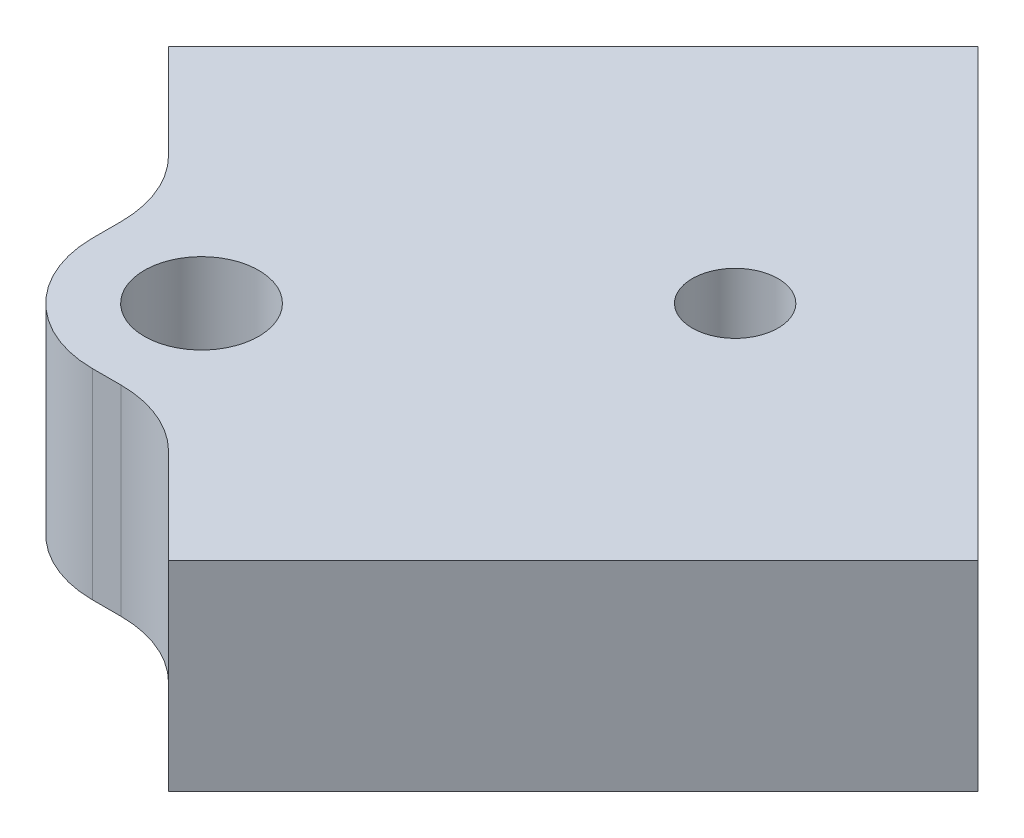
ISO-10303-21;
HEADER;
FILE_DESCRIPTION(('STEP AP214'),'2;1');
FILE_NAME('part.step','',(''),(''),'','','');
FILE_SCHEMA(('AUTOMOTIVE_DESIGN { 1 0 10303 214 1 1 1 1 }'));
ENDSEC;
DATA;
#1=APPLICATION_CONTEXT('core data for automotive mechanical design processes');
#2=APPLICATION_PROTOCOL_DEFINITION('international standard','automotive_design',2000,#1);
#3=PRODUCT_CONTEXT('',#1,'mechanical');
#4=PRODUCT('Part','Part','',(#3));
#5=PRODUCT_RELATED_PRODUCT_CATEGORY('part','',(#4));
#6=PRODUCT_DEFINITION_FORMATION('','',#4);
#7=PRODUCT_DEFINITION_CONTEXT('part definition',#1,'design');
#8=PRODUCT_DEFINITION('design','',#6,#7);
#9=PRODUCT_DEFINITION_SHAPE('','',#8);
#10=(LENGTH_UNIT() NAMED_UNIT(*) SI_UNIT(.MILLI.,.METRE.));
#11=(NAMED_UNIT(*) PLANE_ANGLE_UNIT() SI_UNIT($,.RADIAN.));
#12=(NAMED_UNIT(*) SI_UNIT($,.STERADIAN.) SOLID_ANGLE_UNIT());
#13=UNCERTAINTY_MEASURE_WITH_UNIT(LENGTH_MEASURE(1.E-05),#10,'distance_accuracy_value','');
#14=(GEOMETRIC_REPRESENTATION_CONTEXT(3) GLOBAL_UNCERTAINTY_ASSIGNED_CONTEXT((#13)) GLOBAL_UNIT_ASSIGNED_CONTEXT((#10,
#11,#12)) REPRESENTATION_CONTEXT('',''));
#15=CARTESIAN_POINT('',(0.,0.,0.));
#16=DIRECTION('',(0.,0.,1.));
#17=DIRECTION('',(1.,0.,0.));
#18=AXIS2_PLACEMENT_3D('',#15,#16,#17);
#19=CARTESIAN_POINT('',(1.,7.,7.95));
#20=DIRECTION('',(0.,-1.,0.));
#21=DIRECTION('',(0.,0.,-1.));
#22=AXIS2_PLACEMENT_3D('',#19,#20,#21);
#23=CYLINDRICAL_SURFACE('',#22,4.);
#24=CARTESIAN_POINT('',(1.,0.,7.95));
#25=DIRECTION('',(0.,-1.,0.));
#26=DIRECTION('',(0.,0.,1.));
#27=AXIS2_PLACEMENT_3D('',#24,#25,#26);
#28=CIRCLE('',#27,4.);
#29=CARTESIAN_POINT('',(1.,0.,3.95));
#30=VERTEX_POINT('',#29);
#31=CARTESIAN_POINT('',(3.82842712474619,0.,5.12157287525381));
#32=VERTEX_POINT('',#31);
#33=EDGE_CURVE('E149',#30,#32,#28,.T.);
#34=ORIENTED_EDGE('',*,*,#33,.T.);
#35=DIRECTION('',(0.,-1.,0.));
#36=VECTOR('',#35,1.);
#37=CARTESIAN_POINT('',(3.82842712474619,7.,5.12157287525381));
#38=LINE('',#37,#36);
#39=CARTESIAN_POINT('',(3.82842712474619,7.,5.12157287525381));
#40=VERTEX_POINT('',#39);
#41=EDGE_CURVE('E11',#40,#32,#38,.T.);
#42=ORIENTED_EDGE('',*,*,#41,.F.);
#43=CARTESIAN_POINT('',(1.,7.,7.95));
#44=DIRECTION('',(0.,-1.,0.));
#45=DIRECTION('',(0.,0.,1.));
#46=AXIS2_PLACEMENT_3D('',#43,#44,#45);
#47=CIRCLE('',#46,4.);
#48=CARTESIAN_POINT('',(1.,7.,3.95));
#49=VERTEX_POINT('',#48);
#50=EDGE_CURVE('E168',#49,#40,#47,.T.);
#51=ORIENTED_EDGE('',*,*,#50,.F.);
#52=DIRECTION('',(0.,-1.,0.));
#53=VECTOR('',#52,1.);
#54=CARTESIAN_POINT('',(1.,7.,3.95));
#55=LINE('',#54,#53);
#56=EDGE_CURVE('E145',#49,#30,#55,.T.);
#57=ORIENTED_EDGE('',*,*,#56,.T.);
#58=EDGE_LOOP('',(#34,#42,#51,#57));
#59=FACE_BOUND('',#58,.T.);
#60=ADVANCED_FACE('F41',(#59),#23,.F.);
#61=CARTESIAN_POINT('',(3.82842712474619,7.,5.12157287525381));
#62=DIRECTION('',(0.707106781186548,0.,-0.707106781186548));
#63=DIRECTION('',(-0.707106781186548,0.,-0.707106781186547));
#64=AXIS2_PLACEMENT_3D('',#61,#62,#63);
#65=PLANE('',#64);
#66=DIRECTION('',(0.707106781186548,0.,0.707106781186547));
#67=VECTOR('',#66,1.);
#68=CARTESIAN_POINT('',(3.82842712474619,0.,5.12157287525381));
#69=LINE('',#68,#67);
#70=CARTESIAN_POINT('',(7.13160171779821,0.,8.42474746830583));
#71=VERTEX_POINT('',#70);
#72=EDGE_CURVE('E152',#32,#71,#69,.T.);
#73=ORIENTED_EDGE('',*,*,#72,.T.);
#74=DIRECTION('',(0.,-1.,0.));
#75=VECTOR('',#74,1.);
#76=CARTESIAN_POINT('',(7.13160171779821,7.,8.42474746830583));
#77=LINE('',#76,#75);
#78=CARTESIAN_POINT('',(7.13160171779821,7.,8.42474746830583));
#79=VERTEX_POINT('',#78);
#80=EDGE_CURVE('E49',#79,#71,#77,.T.);
#81=ORIENTED_EDGE('',*,*,#80,.F.);
#82=DIRECTION('',(0.707106781186548,0.,0.707106781186547));
#83=VECTOR('',#82,1.);
#84=CARTESIAN_POINT('',(3.82842712474619,7.,5.12157287525381));
#85=LINE('',#84,#83);
#86=EDGE_CURVE('E106',#40,#79,#85,.T.);
#87=ORIENTED_EDGE('',*,*,#86,.F.);
#88=ORIENTED_EDGE('',*,*,#41,.T.);
#89=EDGE_LOOP('',(#73,#81,#87,#88));
#90=FACE_BOUND('',#89,.T.);
#91=ADVANCED_FACE('F250',(#90),#65,.F.);
#92=CARTESIAN_POINT('',(21.2737373415292,7.,-5.71738815542511));
#93=DIRECTION('',(-0.707106781186548,0.,-0.707106781186548));
#94=DIRECTION('',(-0.707106781186547,0.,0.707106781186548));
#95=AXIS2_PLACEMENT_3D('',#92,#93,#94);
#96=PLANE('',#95);
#97=DIRECTION('',(0.707106781186547,0.,-0.707106781186548));
#98=VECTOR('',#97,1.);
#99=CARTESIAN_POINT('',(21.2737373415292,0.,-5.71738815542511));
#100=LINE('',#99,#98);
#101=CARTESIAN_POINT('',(21.2737373415292,0.,-5.71738815542511));
#102=VERTEX_POINT('',#101);
#103=EDGE_CURVE('E155',#71,#102,#100,.T.);
#104=ORIENTED_EDGE('',*,*,#103,.T.);
#105=DIRECTION('',(0.,-1.,0.));
#106=VECTOR('',#105,1.);
#107=CARTESIAN_POINT('',(21.2737373415292,7.,-5.71738815542511));
#108=LINE('',#107,#106);
#109=CARTESIAN_POINT('',(21.2737373415292,7.,-5.71738815542511));
#110=VERTEX_POINT('',#109);
#111=EDGE_CURVE('E181',#110,#102,#108,.T.);
#112=ORIENTED_EDGE('',*,*,#111,.F.);
#113=DIRECTION('',(0.707106781186547,0.,-0.707106781186548));
#114=VECTOR('',#113,1.);
#115=CARTESIAN_POINT('',(21.2737373415292,7.,-5.71738815542511));
#116=LINE('',#115,#114);
#117=EDGE_CURVE('E189',#79,#110,#116,.T.);
#118=ORIENTED_EDGE('',*,*,#117,.F.);
#119=ORIENTED_EDGE('',*,*,#80,.T.);
#120=EDGE_LOOP('',(#104,#112,#118,#119));
#121=FACE_BOUND('',#120,.T.);
#122=ADVANCED_FACE('F187',(#121),#96,.F.);
#123=CARTESIAN_POINT('',(5.71738815542511,7.,-21.2737373415292));
#124=DIRECTION('',(-0.707106781186548,0.,0.707106781186547));
#125=DIRECTION('',(0.707106781186547,0.,0.707106781186548));
#126=AXIS2_PLACEMENT_3D('',#123,#124,#125);
#127=PLANE('',#126);
#128=DIRECTION('',(-0.707106781186547,0.,-0.707106781186548));
#129=VECTOR('',#128,1.);
#130=CARTESIAN_POINT('',(5.71738815542511,0.,-21.2737373415292));
#131=LINE('',#130,#129);
#132=CARTESIAN_POINT('',(5.71738815542511,0.,-21.2737373415292));
#133=VERTEX_POINT('',#132);
#134=EDGE_CURVE('E157',#102,#133,#131,.T.);
#135=ORIENTED_EDGE('',*,*,#134,.T.);
#136=DIRECTION('',(0.,-1.,0.));
#137=VECTOR('',#136,1.);
#138=CARTESIAN_POINT('',(5.71738815542511,7.,-21.2737373415292));
#139=LINE('',#138,#137);
#140=CARTESIAN_POINT('',(5.71738815542511,7.,-21.2737373415292));
#141=VERTEX_POINT('',#140);
#142=EDGE_CURVE('E178',#141,#133,#139,.T.);
#143=ORIENTED_EDGE('',*,*,#142,.F.);
#144=DIRECTION('',(-0.707106781186547,0.,-0.707106781186548));
#145=VECTOR('',#144,1.);
#146=CARTESIAN_POINT('',(5.71738815542511,7.,-21.2737373415292));
#147=LINE('',#146,#145);
#148=EDGE_CURVE('E207',#110,#141,#147,.T.);
#149=ORIENTED_EDGE('',*,*,#148,.F.);
#150=ORIENTED_EDGE('',*,*,#111,.T.);
#151=EDGE_LOOP('',(#135,#143,#149,#150));
#152=FACE_BOUND('',#151,.T.);
#153=ADVANCED_FACE('F198',(#152),#127,.F.);
#154=CARTESIAN_POINT('',(-8.42474746830583,7.,-7.13160171779821));
#155=DIRECTION('',(0.707106781186548,0.,0.707106781186547));
#156=DIRECTION('',(0.707106781186547,0.,-0.707106781186548));
#157=AXIS2_PLACEMENT_3D('',#154,#155,#156);
#158=PLANE('',#157);
#159=DIRECTION('',(-0.707106781186547,0.,0.707106781186548));
#160=VECTOR('',#159,1.);
#161=CARTESIAN_POINT('',(-8.42474746830583,0.,-7.13160171779821));
#162=LINE('',#161,#160);
#163=CARTESIAN_POINT('',(-8.42474746830583,0.,-7.13160171779821));
#164=VERTEX_POINT('',#163);
#165=EDGE_CURVE('E159',#133,#164,#162,.T.);
#166=ORIENTED_EDGE('',*,*,#165,.T.);
#167=DIRECTION('',(0.,-1.,0.));
#168=VECTOR('',#167,1.);
#169=CARTESIAN_POINT('',(-8.42474746830583,7.,-7.13160171779821));
#170=LINE('',#169,#168);
#171=CARTESIAN_POINT('',(-8.42474746830583,7.,-7.13160171779821));
#172=VERTEX_POINT('',#171);
#173=EDGE_CURVE('E175',#172,#164,#170,.T.);
#174=ORIENTED_EDGE('',*,*,#173,.F.);
#175=DIRECTION('',(-0.707106781186547,0.,0.707106781186548));
#176=VECTOR('',#175,1.);
#177=CARTESIAN_POINT('',(-8.42474746830583,7.,-7.13160171779821));
#178=LINE('',#177,#176);
#179=EDGE_CURVE('E204',#141,#172,#178,.T.);
#180=ORIENTED_EDGE('',*,*,#179,.F.);
#181=ORIENTED_EDGE('',*,*,#142,.T.);
#182=EDGE_LOOP('',(#166,#174,#180,#181));
#183=FACE_BOUND('',#182,.T.);
#184=ADVANCED_FACE('F202',(#183),#158,.F.);
#185=CARTESIAN_POINT('',(-8.42474746830583,7.,-7.13160171779821));
#186=DIRECTION('',(0.707106781186547,0.,-0.707106781186547));
#187=DIRECTION('',(-0.707106781186548,0.,-0.707106781186548));
#188=AXIS2_PLACEMENT_3D('',#185,#186,#187);
#189=PLANE('',#188);
#190=DIRECTION('',(0.707106781186548,0.,0.707106781186548));
#191=VECTOR('',#190,1.);
#192=CARTESIAN_POINT('',(-8.42474746830583,0.,-7.13160171779821));
#193=LINE('',#192,#191);
#194=CARTESIAN_POINT('',(-5.12157287525381,0.,-3.82842712474619));
#195=VERTEX_POINT('',#194);
#196=EDGE_CURVE('E161',#164,#195,#193,.T.);
#197=ORIENTED_EDGE('',*,*,#196,.T.);
#198=DIRECTION('',(0.,-1.,0.));
#199=VECTOR('',#198,1.);
#200=CARTESIAN_POINT('',(-5.12157287525381,7.,-3.82842712474619));
#201=LINE('',#200,#199);
#202=CARTESIAN_POINT('',(-5.12157287525381,7.,-3.82842712474619));
#203=VERTEX_POINT('',#202);
#204=EDGE_CURVE('E172',#203,#195,#201,.T.);
#205=ORIENTED_EDGE('',*,*,#204,.F.);
#206=DIRECTION('',(0.707106781186548,0.,0.707106781186548));
#207=VECTOR('',#206,1.);
#208=CARTESIAN_POINT('',(-8.42474746830583,7.,-7.13160171779821));
#209=LINE('',#208,#207);
#210=EDGE_CURVE('E206',#172,#203,#209,.T.);
#211=ORIENTED_EDGE('',*,*,#210,.F.);
#212=ORIENTED_EDGE('',*,*,#173,.T.);
#213=EDGE_LOOP('',(#197,#205,#211,#212));
#214=FACE_BOUND('',#213,.T.);
#215=ADVANCED_FACE('F262',(#214),#189,.F.);
#216=CARTESIAN_POINT('',(-7.95,7.,-1.));
#217=DIRECTION('',(0.,-1.,0.));
#218=DIRECTION('',(0.,0.,-1.));
#219=AXIS2_PLACEMENT_3D('',#216,#217,#218);
#220=CYLINDRICAL_SURFACE('',#219,4.);
#221=CARTESIAN_POINT('',(-7.95,0.,-1.));
#222=DIRECTION('',(0.,-1.,0.));
#223=DIRECTION('',(0.,0.,1.));
#224=AXIS2_PLACEMENT_3D('',#221,#222,#223);
#225=CIRCLE('',#224,4.);
#226=CARTESIAN_POINT('',(-3.95,0.,-1.));
#227=VERTEX_POINT('',#226);
#228=EDGE_CURVE('E163',#195,#227,#225,.T.);
#229=ORIENTED_EDGE('',*,*,#228,.T.);
#230=DIRECTION('',(0.,-1.,0.));
#231=VECTOR('',#230,1.);
#232=CARTESIAN_POINT('',(-3.95,7.,-1.));
#233=LINE('',#232,#231);
#234=CARTESIAN_POINT('',(-3.95,7.,-1.));
#235=VERTEX_POINT('',#234);
#236=EDGE_CURVE('E140',#235,#227,#233,.T.);
#237=ORIENTED_EDGE('',*,*,#236,.F.);
#238=CARTESIAN_POINT('',(-7.95,7.,-1.));
#239=DIRECTION('',(0.,-1.,0.));
#240=DIRECTION('',(0.,0.,1.));
#241=AXIS2_PLACEMENT_3D('',#238,#239,#240);
#242=CIRCLE('',#241,4.);
#243=EDGE_CURVE('E131',#203,#235,#242,.T.);
#244=ORIENTED_EDGE('',*,*,#243,.F.);
#245=ORIENTED_EDGE('',*,*,#204,.T.);
#246=EDGE_LOOP('',(#229,#237,#244,#245));
#247=FACE_BOUND('',#246,.T.);
#248=ADVANCED_FACE('F259',(#247),#220,.F.);
#249=CARTESIAN_POINT('',(-3.95,7.,0.));
#250=DIRECTION('',(1.,0.,0.));
#251=DIRECTION('',(0.,0.,-1.));
#252=AXIS2_PLACEMENT_3D('',#249,#250,#251);
#253=PLANE('',#252);
#254=DIRECTION('',(0.,0.,1.));
#255=VECTOR('',#254,1.);
#256=CARTESIAN_POINT('',(-3.95,0.,0.));
#257=LINE('',#256,#255);
#258=CARTESIAN_POINT('',(-3.95,0.,0.));
#259=VERTEX_POINT('',#258);
#260=EDGE_CURVE('E139',#227,#259,#257,.T.);
#261=ORIENTED_EDGE('',*,*,#260,.T.);
#262=DIRECTION('',(0.,-1.,0.));
#263=VECTOR('',#262,1.);
#264=CARTESIAN_POINT('',(-3.95,7.,0.));
#265=LINE('',#264,#263);
#266=CARTESIAN_POINT('',(-3.95,7.,0.));
#267=VERTEX_POINT('',#266);
#268=EDGE_CURVE('E136',#267,#259,#265,.T.);
#269=ORIENTED_EDGE('',*,*,#268,.F.);
#270=DIRECTION('',(0.,0.,1.));
#271=VECTOR('',#270,1.);
#272=CARTESIAN_POINT('',(-3.95,7.,0.));
#273=LINE('',#272,#271);
#274=EDGE_CURVE('E125',#235,#267,#273,.T.);
#275=ORIENTED_EDGE('',*,*,#274,.F.);
#276=ORIENTED_EDGE('',*,*,#236,.T.);
#277=EDGE_LOOP('',(#261,#269,#275,#276));
#278=FACE_BOUND('',#277,.T.);
#279=ADVANCED_FACE('F137',(#278),#253,.F.);
#280=CARTESIAN_POINT('',(0.,7.,0.));
#281=DIRECTION('',(0.,-1.,0.));
#282=DIRECTION('',(0.,0.,-1.));
#283=AXIS2_PLACEMENT_3D('',#280,#281,#282);
#284=CYLINDRICAL_SURFACE('',#283,3.95);
#285=CARTESIAN_POINT('',(0.,0.,0.));
#286=DIRECTION('',(0.,1.,0.));
#287=DIRECTION('',(0.,0.,1.));
#288=AXIS2_PLACEMENT_3D('',#285,#286,#287);
#289=CIRCLE('',#288,3.95);
#290=CARTESIAN_POINT('',(0.,0.,3.95));
#291=VERTEX_POINT('',#290);
#292=EDGE_CURVE('E92',#259,#291,#289,.T.);
#293=ORIENTED_EDGE('',*,*,#292,.T.);
#294=DIRECTION('',(0.,-1.,0.));
#295=VECTOR('',#294,1.);
#296=CARTESIAN_POINT('',(0.,7.,3.95));
#297=LINE('',#296,#295);
#298=CARTESIAN_POINT('',(0.,7.,3.95));
#299=VERTEX_POINT('',#298);
#300=EDGE_CURVE('E141',#299,#291,#297,.T.);
#301=ORIENTED_EDGE('',*,*,#300,.F.);
#302=CARTESIAN_POINT('',(0.,7.,0.));
#303=DIRECTION('',(0.,1.,0.));
#304=DIRECTION('',(0.,0.,1.));
#305=AXIS2_PLACEMENT_3D('',#302,#303,#304);
#306=CIRCLE('',#305,3.95);
#307=EDGE_CURVE('E129',#267,#299,#306,.T.);
#308=ORIENTED_EDGE('',*,*,#307,.F.);
#309=ORIENTED_EDGE('',*,*,#268,.T.);
#310=EDGE_LOOP('',(#293,#301,#308,#309));
#311=FACE_BOUND('',#310,.T.);
#312=ADVANCED_FACE('F143',(#311),#284,.T.);
#313=CARTESIAN_POINT('',(0.,7.,3.95));
#314=DIRECTION('',(0.,0.,-1.));
#315=DIRECTION('',(-1.,0.,0.));
#316=AXIS2_PLACEMENT_3D('',#313,#314,#315);
#317=PLANE('',#316);
#318=DIRECTION('',(1.,0.,0.));
#319=VECTOR('',#318,1.);
#320=CARTESIAN_POINT('',(0.,0.,3.95));
#321=LINE('',#320,#319);
#322=EDGE_CURVE('E98',#291,#30,#321,.T.);
#323=ORIENTED_EDGE('',*,*,#322,.T.);
#324=ORIENTED_EDGE('',*,*,#56,.F.);
#325=DIRECTION('',(1.,0.,0.));
#326=VECTOR('',#325,1.);
#327=CARTESIAN_POINT('',(0.,7.,3.95));
#328=LINE('',#327,#326);
#329=EDGE_CURVE('E57',#299,#49,#328,.T.);
#330=ORIENTED_EDGE('',*,*,#329,.F.);
#331=ORIENTED_EDGE('',*,*,#300,.T.);
#332=EDGE_LOOP('',(#323,#324,#330,#331));
#333=FACE_BOUND('',#332,.T.);
#334=ADVANCED_FACE('F231',(#333),#317,.F.);
#335=CARTESIAN_POINT('',(1.,7.,7.95));
#336=DIRECTION('',(0.,1.,0.));
#337=DIRECTION('',(0.,0.,1.));
#338=AXIS2_PLACEMENT_3D('',#335,#336,#337);
#339=PLANE('',#338);
#340=CARTESIAN_POINT('',(9.25292206135777,7.,-9.25292206135794));
#341=DIRECTION('',(0.,1.,0.));
#342=DIRECTION('',(0.,0.,1.));
#343=AXIS2_PLACEMENT_3D('',#340,#341,#342);
#344=CIRCLE('',#343,1.5);
#345=CARTESIAN_POINT('',(9.25292206135777,7.,-7.75292206135794));
#346=VERTEX_POINT('',#345);
#347=EDGE_CURVE('E223',#346,#346,#344,.T.);
#348=ORIENTED_EDGE('',*,*,#347,.F.);
#349=EDGE_LOOP('',(#348));
#350=FACE_BOUND('',#349,.T.);
#351=CARTESIAN_POINT('',(-0.0707106781186546,7.,0.0707106781186549));
#352=DIRECTION('',(0.,1.,0.));
#353=DIRECTION('',(0.,0.,1.));
#354=AXIS2_PLACEMENT_3D('',#351,#352,#353);
#355=CIRCLE('',#354,1.99999999999999);
#356=CARTESIAN_POINT('',(-0.0707106781186546,7.,2.07071067811864));
#357=VERTEX_POINT('',#356);
#358=EDGE_CURVE('E217',#357,#357,#355,.T.);
#359=ORIENTED_EDGE('',*,*,#358,.F.);
#360=EDGE_LOOP('',(#359));
#361=FACE_BOUND('',#360,.T.);
#362=ORIENTED_EDGE('',*,*,#50,.T.);
#363=ORIENTED_EDGE('',*,*,#86,.T.);
#364=ORIENTED_EDGE('',*,*,#117,.T.);
#365=ORIENTED_EDGE('',*,*,#148,.T.);
#366=ORIENTED_EDGE('',*,*,#179,.T.);
#367=ORIENTED_EDGE('',*,*,#210,.T.);
#368=ORIENTED_EDGE('',*,*,#243,.T.);
#369=ORIENTED_EDGE('',*,*,#274,.T.);
#370=ORIENTED_EDGE('',*,*,#307,.T.);
#371=ORIENTED_EDGE('',*,*,#329,.T.);
#372=EDGE_LOOP('',(#362,#363,#364,#365,#366,#367,#368,#369,#370,#371));
#373=FACE_BOUND('',#372,.T.);
#374=ADVANCED_FACE('F127',(#350,#361,#373),#339,.T.);
#375=CARTESIAN_POINT('',(1.,0.,7.95));
#376=DIRECTION('',(0.,1.,0.));
#377=DIRECTION('',(0.,0.,1.));
#378=AXIS2_PLACEMENT_3D('',#375,#376,#377);
#379=PLANE('',#378);
#380=CARTESIAN_POINT('',(9.25292206135777,0.,-9.25292206135794));
#381=DIRECTION('',(0.,1.,0.));
#382=DIRECTION('',(0.,0.,1.));
#383=AXIS2_PLACEMENT_3D('',#380,#381,#382);
#384=CIRCLE('',#383,1.5);
#385=CARTESIAN_POINT('',(9.25292206135777,0.,-7.75292206135794));
#386=VERTEX_POINT('',#385);
#387=EDGE_CURVE('E220',#386,#386,#384,.T.);
#388=ORIENTED_EDGE('',*,*,#387,.T.);
#389=EDGE_LOOP('',(#388));
#390=FACE_BOUND('',#389,.T.);
#391=CARTESIAN_POINT('',(-0.0707106781186546,0.,0.0707106781186549));
#392=DIRECTION('',(0.,1.,0.));
#393=DIRECTION('',(0.,0.,1.));
#394=AXIS2_PLACEMENT_3D('',#391,#392,#393);
#395=CIRCLE('',#394,1.99999999999999);
#396=CARTESIAN_POINT('',(-0.0707106781186546,0.,2.07071067811864));
#397=VERTEX_POINT('',#396);
#398=EDGE_CURVE('E153',#397,#397,#395,.T.);
#399=ORIENTED_EDGE('',*,*,#398,.T.);
#400=EDGE_LOOP('',(#399));
#401=FACE_BOUND('',#400,.T.);
#402=ORIENTED_EDGE('',*,*,#33,.F.);
#403=ORIENTED_EDGE('',*,*,#322,.F.);
#404=ORIENTED_EDGE('',*,*,#292,.F.);
#405=ORIENTED_EDGE('',*,*,#260,.F.);
#406=ORIENTED_EDGE('',*,*,#228,.F.);
#407=ORIENTED_EDGE('',*,*,#196,.F.);
#408=ORIENTED_EDGE('',*,*,#165,.F.);
#409=ORIENTED_EDGE('',*,*,#134,.F.);
#410=ORIENTED_EDGE('',*,*,#103,.F.);
#411=ORIENTED_EDGE('',*,*,#72,.F.);
#412=EDGE_LOOP('',(#402,#403,#404,#405,#406,#407,#408,#409,#410,#411));
#413=FACE_BOUND('',#412,.T.);
#414=ADVANCED_FACE('F193',(#390,#401,#413),#379,.F.);
#415=CARTESIAN_POINT('',(-0.0707106781186546,7.,0.0707106781186549));
#416=DIRECTION('',(0.,1.,0.));
#417=DIRECTION('',(0.,0.,1.));
#418=AXIS2_PLACEMENT_3D('',#415,#416,#417);
#419=CYLINDRICAL_SURFACE('',#418,1.99999999999999);
#420=ORIENTED_EDGE('',*,*,#398,.F.);
#421=EDGE_LOOP('',(#420));
#422=FACE_BOUND('',#421,.T.);
#423=ORIENTED_EDGE('',*,*,#358,.T.);
#424=EDGE_LOOP('',(#423));
#425=FACE_BOUND('',#424,.T.);
#426=ADVANCED_FACE('F235',(#422,#425),#419,.F.);
#427=CARTESIAN_POINT('',(9.25292206135777,7.,-9.25292206135794));
#428=DIRECTION('',(0.,1.,0.));
#429=DIRECTION('',(0.,0.,1.));
#430=AXIS2_PLACEMENT_3D('',#427,#428,#429);
#431=CYLINDRICAL_SURFACE('',#430,1.5);
#432=ORIENTED_EDGE('',*,*,#387,.F.);
#433=EDGE_LOOP('',(#432));
#434=FACE_BOUND('',#433,.T.);
#435=ORIENTED_EDGE('',*,*,#347,.T.);
#436=EDGE_LOOP('',(#435));
#437=FACE_BOUND('',#436,.T.);
#438=ADVANCED_FACE('F227',(#434,#437),#431,.F.);
#439=CLOSED_SHELL('',(#60,#91,#122,#153,#184,#215,#248,#279,#312,#334,#374,#414,#426,#438));
#440=MANIFOLD_SOLID_BREP('B2',#439);
#441=ADVANCED_BREP_SHAPE_REPRESENTATION('',(#18,#440),#14);
#442=SHAPE_DEFINITION_REPRESENTATION(#9,#441);
ENDSEC;
END-ISO-10303-21;
